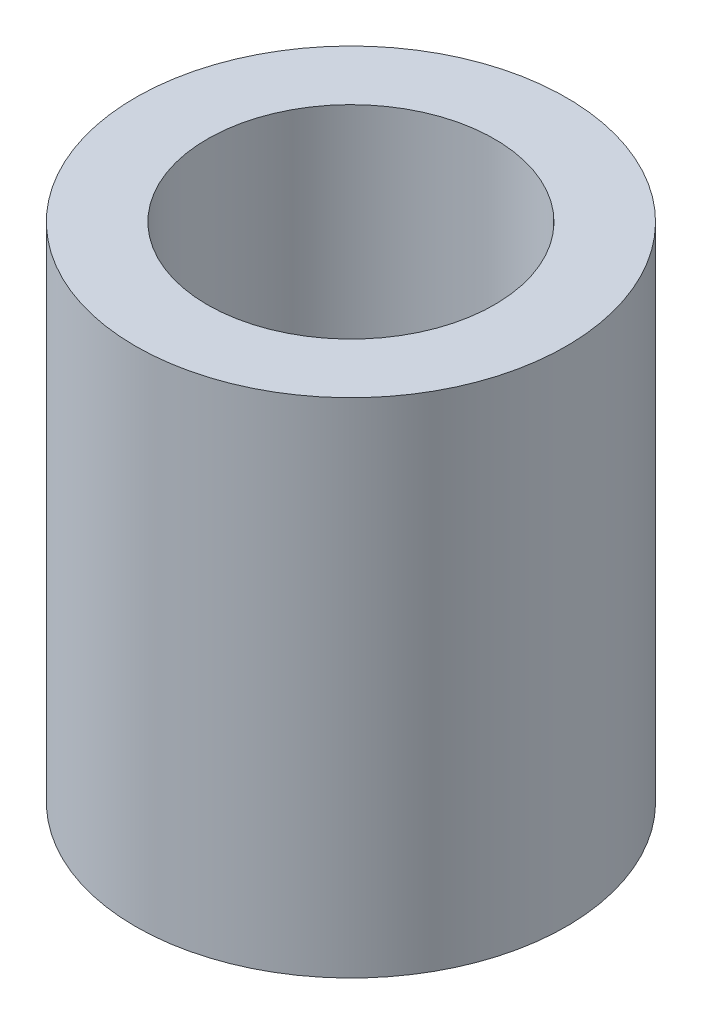
ISO-10303-21;
HEADER;
FILE_DESCRIPTION(('STEP AP214'),'2;1');
FILE_NAME('part.step','',(''),(''),'','','');
FILE_SCHEMA(('AUTOMOTIVE_DESIGN { 1 0 10303 214 1 1 1 1 }'));
ENDSEC;
DATA;
#1=APPLICATION_CONTEXT('core data for automotive mechanical design processes');
#2=APPLICATION_PROTOCOL_DEFINITION('international standard','automotive_design',2000,#1);
#3=PRODUCT_CONTEXT('',#1,'mechanical');
#4=PRODUCT('Part','Part','',(#3));
#5=PRODUCT_RELATED_PRODUCT_CATEGORY('part','',(#4));
#6=PRODUCT_DEFINITION_FORMATION('','',#4);
#7=PRODUCT_DEFINITION_CONTEXT('part definition',#1,'design');
#8=PRODUCT_DEFINITION('design','',#6,#7);
#9=PRODUCT_DEFINITION_SHAPE('','',#8);
#10=(LENGTH_UNIT() NAMED_UNIT(*) SI_UNIT(.MILLI.,.METRE.));
#11=(NAMED_UNIT(*) PLANE_ANGLE_UNIT() SI_UNIT($,.RADIAN.));
#12=(NAMED_UNIT(*) SI_UNIT($,.STERADIAN.) SOLID_ANGLE_UNIT());
#13=UNCERTAINTY_MEASURE_WITH_UNIT(LENGTH_MEASURE(1.E-05),#10,'distance_accuracy_value','');
#14=(GEOMETRIC_REPRESENTATION_CONTEXT(3) GLOBAL_UNCERTAINTY_ASSIGNED_CONTEXT((#13)) GLOBAL_UNIT_ASSIGNED_CONTEXT((#10,
#11,#12)) REPRESENTATION_CONTEXT('',''));
#15=CARTESIAN_POINT('',(0.,0.,0.));
#16=DIRECTION('',(0.,0.,1.));
#17=DIRECTION('',(1.,0.,0.));
#18=AXIS2_PLACEMENT_3D('',#15,#16,#17);
#19=CARTESIAN_POINT('',(0.,7.,0.));
#20=DIRECTION('',(0.,1.,0.));
#21=DIRECTION('',(0.,0.,1.));
#22=AXIS2_PLACEMENT_3D('',#19,#20,#21);
#23=PLANE('',#22);
#24=CARTESIAN_POINT('',(0.,7.,0.));
#25=DIRECTION('',(0.,1.,0.));
#26=DIRECTION('',(0.,0.,1.));
#27=AXIS2_PLACEMENT_3D('',#24,#25,#26);
#28=CIRCLE('',#27,3.);
#29=CARTESIAN_POINT('',(0.,7.,3.));
#30=VERTEX_POINT('',#29);
#31=EDGE_CURVE('E10',#30,#30,#28,.T.);
#32=ORIENTED_EDGE('',*,*,#31,.T.);
#33=EDGE_LOOP('',(#32));
#34=FACE_BOUND('',#33,.T.);
#35=CARTESIAN_POINT('',(0.,7.,0.));
#36=DIRECTION('',(0.,1.,0.));
#37=DIRECTION('',(0.,0.,1.));
#38=AXIS2_PLACEMENT_3D('',#35,#36,#37);
#39=CIRCLE('',#38,2.);
#40=CARTESIAN_POINT('',(0.,7.,2.));
#41=VERTEX_POINT('',#40);
#42=EDGE_CURVE('E56',#41,#41,#39,.T.);
#43=ORIENTED_EDGE('',*,*,#42,.F.);
#44=EDGE_LOOP('',(#43));
#45=FACE_BOUND('',#44,.T.);
#46=ADVANCED_FACE('F43',(#34,#45),#23,.T.);
#47=CARTESIAN_POINT('',(0.,0.,0.));
#48=DIRECTION('',(0.,1.,0.));
#49=DIRECTION('',(0.,0.,1.));
#50=AXIS2_PLACEMENT_3D('',#47,#48,#49);
#51=PLANE('',#50);
#52=CARTESIAN_POINT('',(0.,0.,0.));
#53=DIRECTION('',(0.,1.,0.));
#54=DIRECTION('',(0.,0.,1.));
#55=AXIS2_PLACEMENT_3D('',#52,#53,#54);
#56=CIRCLE('',#55,3.);
#57=CARTESIAN_POINT('',(0.,0.,3.));
#58=VERTEX_POINT('',#57);
#59=EDGE_CURVE('E47',#58,#58,#56,.T.);
#60=ORIENTED_EDGE('',*,*,#59,.F.);
#61=EDGE_LOOP('',(#60));
#62=FACE_BOUND('',#61,.T.);
#63=CARTESIAN_POINT('',(0.,0.,0.));
#64=DIRECTION('',(0.,1.,0.));
#65=DIRECTION('',(0.,0.,1.));
#66=AXIS2_PLACEMENT_3D('',#63,#64,#65);
#67=CIRCLE('',#66,2.);
#68=CARTESIAN_POINT('',(0.,0.,2.));
#69=VERTEX_POINT('',#68);
#70=EDGE_CURVE('E58',#69,#69,#67,.T.);
#71=ORIENTED_EDGE('',*,*,#70,.T.);
#72=EDGE_LOOP('',(#71));
#73=FACE_BOUND('',#72,.T.);
#74=ADVANCED_FACE('F70',(#62,#73),#51,.F.);
#75=CARTESIAN_POINT('',(0.,7.,0.));
#76=DIRECTION('',(0.,-1.,0.));
#77=DIRECTION('',(0.,0.,-1.));
#78=AXIS2_PLACEMENT_3D('',#75,#76,#77);
#79=CYLINDRICAL_SURFACE('',#78,3.);
#80=ORIENTED_EDGE('',*,*,#31,.F.);
#81=EDGE_LOOP('',(#80));
#82=FACE_BOUND('',#81,.T.);
#83=ORIENTED_EDGE('',*,*,#59,.T.);
#84=EDGE_LOOP('',(#83));
#85=FACE_BOUND('',#84,.T.);
#86=ADVANCED_FACE('F45',(#82,#85),#79,.T.);
#87=CARTESIAN_POINT('',(0.,7.,0.));
#88=DIRECTION('',(0.,-1.,0.));
#89=DIRECTION('',(0.,0.,-1.));
#90=AXIS2_PLACEMENT_3D('',#87,#88,#89);
#91=CYLINDRICAL_SURFACE('',#90,2.);
#92=ORIENTED_EDGE('',*,*,#42,.T.);
#93=EDGE_LOOP('',(#92));
#94=FACE_BOUND('',#93,.T.);
#95=ORIENTED_EDGE('',*,*,#70,.F.);
#96=EDGE_LOOP('',(#95));
#97=FACE_BOUND('',#96,.T.);
#98=ADVANCED_FACE('F66',(#94,#97),#91,.F.);
#99=CLOSED_SHELL('',(#46,#74,#86,#98));
#100=MANIFOLD_SOLID_BREP('B2',#99);
#101=ADVANCED_BREP_SHAPE_REPRESENTATION('',(#18,#100),#14);
#102=SHAPE_DEFINITION_REPRESENTATION(#9,#101);
ENDSEC;
END-ISO-10303-21;
